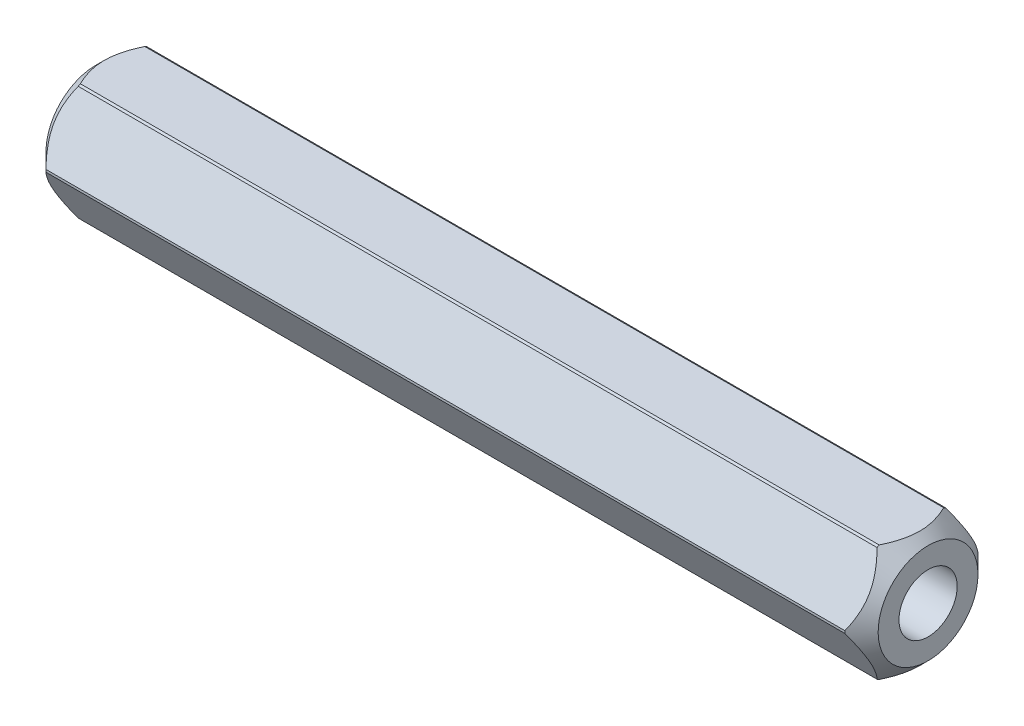
ISO-10303-21;
HEADER;
FILE_DESCRIPTION(('STEP AP214'),'2;1');
FILE_NAME('part.step','',(''),(''),'','','');
FILE_SCHEMA(('AUTOMOTIVE_DESIGN { 1 0 10303 214 1 1 1 1 }'));
ENDSEC;
DATA;
#1=APPLICATION_CONTEXT('core data for automotive mechanical design processes');
#2=APPLICATION_PROTOCOL_DEFINITION('international standard','automotive_design',2000,#1);
#3=PRODUCT_CONTEXT('',#1,'mechanical');
#4=PRODUCT('Part','Part','',(#3));
#5=PRODUCT_RELATED_PRODUCT_CATEGORY('part','',(#4));
#6=PRODUCT_DEFINITION_FORMATION('','',#4);
#7=PRODUCT_DEFINITION_CONTEXT('part definition',#1,'design');
#8=PRODUCT_DEFINITION('design','',#6,#7);
#9=PRODUCT_DEFINITION_SHAPE('','',#8);
#10=(LENGTH_UNIT() NAMED_UNIT(*) SI_UNIT(.MILLI.,.METRE.));
#11=(NAMED_UNIT(*) PLANE_ANGLE_UNIT() SI_UNIT($,.RADIAN.));
#12=(NAMED_UNIT(*) SI_UNIT($,.STERADIAN.) SOLID_ANGLE_UNIT());
#13=UNCERTAINTY_MEASURE_WITH_UNIT(LENGTH_MEASURE(1.E-05),#10,'distance_accuracy_value','');
#14=(GEOMETRIC_REPRESENTATION_CONTEXT(3) GLOBAL_UNCERTAINTY_ASSIGNED_CONTEXT((#13)) GLOBAL_UNIT_ASSIGNED_CONTEXT((#10,
#11,#12)) REPRESENTATION_CONTEXT('',''));
#15=CARTESIAN_POINT('',(0.,0.,0.));
#16=DIRECTION('',(0.,0.,1.));
#17=DIRECTION('',(1.,0.,0.));
#18=AXIS2_PLACEMENT_3D('',#15,#16,#17);
#19=CARTESIAN_POINT('',(25.,0.,0.));
#20=DIRECTION('',(1.,0.,0.));
#21=DIRECTION('',(0.,0.,-1.));
#22=AXIS2_PLACEMENT_3D('',#19,#20,#21);
#23=PLANE('',#22);
#24=CARTESIAN_POINT('',(25.,0.,0.));
#25=DIRECTION('',(1.,0.,0.));
#26=DIRECTION('',(0.,0.,-1.));
#27=AXIS2_PLACEMENT_3D('',#24,#25,#26);
#28=CIRCLE('',#27,1.75);
#29=CARTESIAN_POINT('',(25.,0.,-1.75));
#30=VERTEX_POINT('',#29);
#31=EDGE_CURVE('E190',#30,#30,#28,.T.);
#32=ORIENTED_EDGE('',*,*,#31,.F.);
#33=EDGE_LOOP('',(#32));
#34=FACE_BOUND('',#33,.T.);
#35=CARTESIAN_POINT('',(25.,0.,0.));
#36=DIRECTION('',(1.,0.,0.));
#37=DIRECTION('',(0.,0.,-1.));
#38=AXIS2_PLACEMENT_3D('',#35,#36,#37);
#39=CIRCLE('',#38,3.00000000000016);
#40=CARTESIAN_POINT('',(25.,0.,-3.00000000000016));
#41=VERTEX_POINT('',#40);
#42=EDGE_CURVE('E300',#41,#41,#39,.F.);
#43=ORIENTED_EDGE('',*,*,#42,.F.);
#44=EDGE_LOOP('',(#43));
#45=FACE_BOUND('',#44,.T.);
#46=ADVANCED_FACE('F34',(#34,#45),#23,.T.);
#47=CARTESIAN_POINT('',(-25.,0.,0.));
#48=DIRECTION('',(1.,0.,0.));
#49=DIRECTION('',(0.,0.,-1.));
#50=AXIS2_PLACEMENT_3D('',#47,#48,#49);
#51=PLANE('',#50);
#52=CARTESIAN_POINT('',(-25.,0.,0.));
#53=DIRECTION('',(1.,0.,0.));
#54=DIRECTION('',(0.,0.,-1.));
#55=AXIS2_PLACEMENT_3D('',#52,#53,#54);
#56=CIRCLE('',#55,3.);
#57=CARTESIAN_POINT('',(-25.,0.,-3.));
#58=VERTEX_POINT('',#57);
#59=EDGE_CURVE('E272',#58,#58,#56,.F.);
#60=ORIENTED_EDGE('',*,*,#59,.T.);
#61=EDGE_LOOP('',(#60));
#62=FACE_BOUND('',#61,.T.);
#63=CARTESIAN_POINT('',(-25.,0.,0.));
#64=DIRECTION('',(1.,0.,0.));
#65=DIRECTION('',(0.,0.,-1.));
#66=AXIS2_PLACEMENT_3D('',#63,#64,#65);
#67=CIRCLE('',#66,1.75);
#68=CARTESIAN_POINT('',(-25.,0.,-1.75));
#69=VERTEX_POINT('',#68);
#70=EDGE_CURVE('E187',#69,#69,#67,.T.);
#71=ORIENTED_EDGE('',*,*,#70,.T.);
#72=EDGE_LOOP('',(#71));
#73=FACE_BOUND('',#72,.T.);
#74=ADVANCED_FACE('F320',(#62,#73),#51,.F.);
#75=CARTESIAN_POINT('',(-25.,0.,0.));
#76=DIRECTION('',(1.,0.,0.));
#77=DIRECTION('',(0.,0.,-1.));
#78=AXIS2_PLACEMENT_3D('',#75,#76,#77);
#79=CYLINDRICAL_SURFACE('',#78,1.75);
#80=ORIENTED_EDGE('',*,*,#70,.F.);
#81=EDGE_LOOP('',(#80));
#82=FACE_BOUND('',#81,.T.);
#83=ORIENTED_EDGE('',*,*,#31,.T.);
#84=EDGE_LOOP('',(#83));
#85=FACE_BOUND('',#84,.T.);
#86=ADVANCED_FACE('F339',(#82,#85),#79,.F.);
#87=CARTESIAN_POINT('',(24.,0.,0.));
#88=DIRECTION('',(-1.,0.,0.));
#89=DIRECTION('',(0.,0.,1.));
#90=AXIS2_PLACEMENT_3D('',#87,#88,#89);
#91=CONICAL_SURFACE('',#90,4.00000000000016,0.785398163397443);
#92=ORIENTED_EDGE('',*,*,#42,.T.);
#93=EDGE_LOOP('',(#92));
#94=FACE_BOUND('',#93,.T.);
#95=CARTESIAN_POINT('',(24.,0.,0.));
#96=DIRECTION('',(1.,0.,0.));
#97=DIRECTION('',(0.,0.,-1.));
#98=AXIS2_PLACEMENT_3D('',#95,#96,#97);
#99=CIRCLE('',#98,4.00000000000016);
#100=CARTESIAN_POINT('',(24.,-0.0729490168751597,-3.99933474979755));
#101=VERTEX_POINT('',#100);
#102=CARTESIAN_POINT('',(24.,0.0729490168751608,-3.99933474979755));
#103=VERTEX_POINT('',#102);
#104=EDGE_CURVE('E121',#101,#103,#99,.T.);
#105=ORIENTED_EDGE('',*,*,#104,.T.);
#106=CARTESIAN_POINT('',(23.9998881914973,3.42725098312484,-2.06272760663984));
#107=CARTESIAN_POINT('',(24.0647344125968,3.31117807943082,-2.12974232883321));
#108=CARTESIAN_POINT('',(24.1255786856645,3.19320798493787,-2.19785239464504));
#109=CARTESIAN_POINT('',(24.2366317215761,2.95289734682205,-2.33659580625034));
#110=CARTESIAN_POINT('',(24.286784041153,2.83053740838046,-2.40724034964761));
#111=CARTESIAN_POINT('',(24.3724702813317,2.58385923610752,-2.5496600588126));
#112=CARTESIAN_POINT('',(24.4082044941501,2.4595946520742,-2.62140424985497));
#113=CARTESIAN_POINT('',(24.4630245319929,2.20853719475156,-2.76635234042227));
#114=CARTESIAN_POINT('',(24.4821471825276,2.0817505545735,-2.83955264125872));
#115=CARTESIAN_POINT('',(24.4994162555899,1.85969340087908,-2.96775739871967));
#116=CARTESIAN_POINT('',(24.5016761760366,1.76465432492154,-3.02262823480729));
#117=CARTESIAN_POINT('',(24.4958688245801,1.57477790433149,-3.13225343734772));
#118=CARTESIAN_POINT('',(24.4877980805935,1.47994063825887,-3.18700775844395));
#119=CARTESIAN_POINT('',(24.4617912511376,1.29121234851855,-3.29597008732923));
#120=CARTESIAN_POINT('',(24.4438458023953,1.19732230919821,-3.35017752680505));
#121=CARTESIAN_POINT('',(24.3990644171697,1.01118607536053,-3.45764333151718));
#122=CARTESIAN_POINT('',(24.3722292687288,0.918939735898197,-3.51090178043751));
#123=CARTESIAN_POINT('',(24.2978081761367,0.69754005659038,-3.63872694488438));
#124=CARTESIAN_POINT('',(24.2462514082614,0.569386591849765,-3.71271638224996));
#125=CARTESIAN_POINT('',(24.1599489411143,0.380574161794556,-3.82172728956868));
#126=CARTESIAN_POINT('',(24.1297390066747,0.318297366937098,-3.8576828138439));
#127=CARTESIAN_POINT('',(24.066693541996,0.194772982909786,-3.92899965021355));
#128=CARTESIAN_POINT('',(24.0338589491643,0.133525035657155,-3.96436116904717));
#129=CARTESIAN_POINT('',(23.9998881914973,0.0727490168751591,-3.99945021985123));
#130=B_SPLINE_CURVE_WITH_KNOTS('',3,(#106,#107,#108,#109,#110,#111,#112,#113,#114,#115,#116,
#117,#118,#119,#120,#121,#122,#123,#124,#125,#126,#127,#128,#129),.UNSPECIFIED.,.F.,.F.,(4,2,2,
2,2,2,2,2,2,2,2,4),(0.,0.446958060798127,0.896220203678139,1.33900659915566,1.78080887560877,
2.10963588118584,2.43857343285382,2.76782342451617,3.09704423706705,3.56636893069617,
3.80032900351678,4.03420588673434),.UNSPECIFIED.);
#131=CARTESIAN_POINT('',(24.0000000000002,3.42705098312484,-2.06284307669368));
#132=VERTEX_POINT('',#131);
#133=EDGE_CURVE('E57',#132,#103,#130,.T.);
#134=ORIENTED_EDGE('',*,*,#133,.F.);
#135=CARTESIAN_POINT('',(24.0000000000001,0.,0.));
#136=DIRECTION('',(-1.,0.,0.));
#137=DIRECTION('',(0.,0.,1.));
#138=AXIS2_PLACEMENT_3D('',#135,#136,#137);
#139=CIRCLE('',#138,4.);
#140=CARTESIAN_POINT('',(24.,3.50000000000015,-1.93649167310379));
#141=VERTEX_POINT('',#140);
#142=EDGE_CURVE('E43',#132,#141,#139,.F.);
#143=ORIENTED_EDGE('',*,*,#142,.T.);
#144=CARTESIAN_POINT('',(22.770955868488,3.5,-3.88495849775799));
#145=CARTESIAN_POINT('',(22.8417265484129,3.5,-3.78968133342106));
#146=CARTESIAN_POINT('',(22.9117700859078,3.5,-3.69385487477247));
#147=CARTESIAN_POINT('',(23.0500827470865,3.5,-3.50089311100164));
#148=CARTESIAN_POINT('',(23.1183513990306,3.5,-3.40375746812528));
#149=CARTESIAN_POINT('',(23.2532777387967,3.5,-3.20725800739164));
#150=CARTESIAN_POINT('',(23.3199188270478,3.5,-3.10788275154336));
#151=CARTESIAN_POINT('',(23.4505691257805,3.5,-2.90742211436168));
#152=CARTESIAN_POINT('',(23.5145785267291,3.5,-2.80633685753881));
#153=CARTESIAN_POINT('',(23.6426606488874,3.5,-2.596850831127));
#154=CARTESIAN_POINT('',(23.7065611101522,3.5,-2.48834419748431));
#155=CARTESIAN_POINT('',(23.82995417224,3.5,-2.26881604431269));
#156=CARTESIAN_POINT('',(23.8894461095312,3.5,-2.15779414947928));
#157=CARTESIAN_POINT('',(24.0027259557816,3.5,-1.93327831444902));
#158=CARTESIAN_POINT('',(24.0565306242003,3.5,-1.81979289704174));
#159=CARTESIAN_POINT('',(24.1572328785999,3.5,-1.58982274063083));
#160=CARTESIAN_POINT('',(24.2041334825553,3.5,-1.47333933845417));
#161=CARTESIAN_POINT('',(24.2866255868552,3.5,-1.24488640020419));
#162=CARTESIAN_POINT('',(24.322752349878,3.5,-1.13311221313753));
#163=CARTESIAN_POINT('',(24.3860160984176,3.5,-0.906999927508603));
#164=CARTESIAN_POINT('',(24.4131524219555,3.5,-0.792661640809517));
#165=CARTESIAN_POINT('',(24.4566050704742,3.5,-0.563937922529062));
#166=CARTESIAN_POINT('',(24.4730982320407,3.5,-0.449586630662198));
#167=CARTESIAN_POINT('',(24.4949670259914,3.5,-0.219820733556376));
#168=CARTESIAN_POINT('',(24.5003442947514,3.5,-0.104406287337859));
#169=CARTESIAN_POINT('',(24.4996324107893,3.5,0.122807086362507));
#170=CARTESIAN_POINT('',(24.4938932489386,3.5,0.234607277156806));
#171=CARTESIAN_POINT('',(24.4720065025217,3.5,0.45717759421166));
#172=CARTESIAN_POINT('',(24.455857864505,3.5,0.567947615066796));
#173=CARTESIAN_POINT('',(24.4137330629689,3.5,0.789526981963729));
#174=CARTESIAN_POINT('',(24.3875944739596,3.5,0.900304974150864));
#175=CARTESIAN_POINT('',(24.3268401154054,3.5,1.11946317061419));
#176=CARTESIAN_POINT('',(24.2922252234766,3.5,1.22784362186017));
#177=CARTESIAN_POINT('',(24.2110957214909,3.5,1.45550446251114));
#178=CARTESIAN_POINT('',(24.1636324842807,3.5,1.5744437105933));
#179=CARTESIAN_POINT('',(24.0614691466234,3.5,1.80919998491844));
#180=CARTESIAN_POINT('',(24.0067655718904,3.5,1.92501547990321));
#181=CARTESIAN_POINT('',(23.8914282911651,3.5,2.15410976764514));
#182=CARTESIAN_POINT('',(23.8307756465663,3.5,2.26737894885669));
#183=CARTESIAN_POINT('',(23.7048864441281,3.5,2.49129904445797));
#184=CARTESIAN_POINT('',(23.6396506383729,3.5,2.60195038446311));
#185=CARTESIAN_POINT('',(23.5088754315315,3.5,2.81548535770476));
#186=CARTESIAN_POINT('',(23.4435161158836,3.5,2.91847986517955));
#187=CARTESIAN_POINT('',(23.3100853837606,3.5,3.12270257109716));
#188=CARTESIAN_POINT('',(23.2420137600851,3.5,3.22393063374388));
#189=CARTESIAN_POINT('',(23.1042146179666,3.5,3.4240244444429));
#190=CARTESIAN_POINT('',(23.0345052925373,3.5,3.52290276638669));
#191=CARTESIAN_POINT('',(22.8932703201578,3.5,3.71931403126321));
#192=CARTESIAN_POINT('',(22.8217451761454,3.5,3.81684733542887));
#193=CARTESIAN_POINT('',(22.7494785915831,3.5,3.91381847563807));
#194=B_SPLINE_CURVE_WITH_KNOTS('',3,(#144,#145,#146,#147,#148,#149,#150,#151,#152,#153,#154,
#155,#156,#157,#158,#159,#160,#161,#162,#163,#164,#165,#166,#167,#168,#169,#170,#171,#172,#173,
#174,#175,#176,#177,#178,#179,#180,#181,#182,#183,#184,#185,#186,#187,#188,#189,#190,#191,#192,
#193),.UNSPECIFIED.,.F.,.F.,(4,2,2,2,2,2,2,2,2,2,2,2,2,2,2,2,2,2,2,2,2,2,2,2,4),(0.,
0.356063700307526,0.712221089425062,1.07114059459626,1.43003407724958,1.80772404165316,
2.18547073760476,2.56207127442214,2.93850669581974,3.29059437139971,3.6427079659425,
3.98880933268275,4.33485974605545,4.67019194132503,5.00555807791287,5.34662632483161,
5.6876592732819,6.0715350021399,6.45559560668382,6.84092119044734,7.22618369036803,
7.59208083740621,7.95800599009131,8.32092560301541,8.68374576965352),.UNSPECIFIED.);
#195=CARTESIAN_POINT('',(24.,3.50000000000015,1.93649167310379));
#196=VERTEX_POINT('',#195);
#197=EDGE_CURVE('E140',#196,#141,#194,.F.);
#198=ORIENTED_EDGE('',*,*,#197,.F.);
#199=CARTESIAN_POINT('',(24.,3.42705098312499,2.06284307669377));
#200=VERTEX_POINT('',#199);
#201=EDGE_CURVE('E131',#196,#200,#99,.T.);
#202=ORIENTED_EDGE('',*,*,#201,.T.);
#203=CARTESIAN_POINT('',(23.9998881914973,0.0727490168751583,3.99945021985123));
#204=CARTESIAN_POINT('',(24.0647344125968,0.18882192056918,3.93243549765786));
#205=CARTESIAN_POINT('',(24.1255786856645,0.306792015062135,3.86432543184603));
#206=CARTESIAN_POINT('',(24.2366317215761,0.547102653177949,3.72558202024073));
#207=CARTESIAN_POINT('',(24.286784041153,0.669462591619539,3.65493747684345));
#208=CARTESIAN_POINT('',(24.3724702813317,0.916140763892482,3.51251776767847));
#209=CARTESIAN_POINT('',(24.4082044941501,1.0404053479258,3.44077357663609));
#210=CARTESIAN_POINT('',(24.4630245319929,1.29146280524844,3.2958254860688));
#211=CARTESIAN_POINT('',(24.4821471825276,1.41824944542651,3.22262518523235));
#212=CARTESIAN_POINT('',(24.4994162555899,1.64030659912093,3.09442042777139));
#213=CARTESIAN_POINT('',(24.5016761760366,1.73534567507847,3.03954959168378));
#214=CARTESIAN_POINT('',(24.4958688245801,1.92522209566852,2.92992438914335));
#215=CARTESIAN_POINT('',(24.4877980805935,2.02005936174113,2.87517006804711));
#216=CARTESIAN_POINT('',(24.4617912511376,2.20878765148146,2.76620773916184));
#217=CARTESIAN_POINT('',(24.4438458023953,2.3026776908018,2.71200029968602));
#218=CARTESIAN_POINT('',(24.3990644171697,2.48881392463948,2.60453449497389));
#219=CARTESIAN_POINT('',(24.3722292687288,2.58106026410181,2.55127604605356));
#220=CARTESIAN_POINT('',(24.2978081761367,2.80245994340962,2.42345088160669));
#221=CARTESIAN_POINT('',(24.2462514082614,2.93061340815024,2.34946144424111));
#222=CARTESIAN_POINT('',(24.1599489411143,3.11942583820545,2.24045053692239));
#223=CARTESIAN_POINT('',(24.1297390066747,3.1817026330629,2.20449501264717));
#224=CARTESIAN_POINT('',(24.0666935419961,3.30522701709021,2.13317817627752));
#225=CARTESIAN_POINT('',(24.0338589491643,3.36647496434285,2.0978166574439));
#226=CARTESIAN_POINT('',(23.9998881914973,3.42725098312484,2.06272760663984));
#227=B_SPLINE_CURVE_WITH_KNOTS('',3,(#203,#204,#205,#206,#207,#208,#209,#210,#211,#212,#213,
#214,#215,#216,#217,#218,#219,#220,#221,#222,#223,#224,#225,#226),.UNSPECIFIED.,.F.,.F.,(4,2,2,
2,2,2,2,2,2,2,2,4),(0.,0.446958060798129,0.896220203678141,1.33900659915567,1.78080887560878,
2.10963588118585,2.43857343285383,2.76782342451618,3.09704423706706,3.56636893069617,
3.80032900351678,4.03420588673434),.UNSPECIFIED.);
#228=CARTESIAN_POINT('',(24.,0.0729490168751613,3.99933474979755));
#229=VERTEX_POINT('',#228);
#230=EDGE_CURVE('E164',#229,#200,#227,.T.);
#231=ORIENTED_EDGE('',*,*,#230,.F.);
#232=CARTESIAN_POINT('',(24.,-0.0729490168751628,3.99933474979755));
#233=VERTEX_POINT('',#232);
#234=EDGE_CURVE('E295',#229,#233,#99,.T.);
#235=ORIENTED_EDGE('',*,*,#234,.T.);
#236=CARTESIAN_POINT('',(23.9998881914972,-3.42725098312484,2.06272760663984));
#237=CARTESIAN_POINT('',(24.0647344125968,-3.31117807943082,2.12974232883321));
#238=CARTESIAN_POINT('',(24.1255786856645,-3.19320798493787,2.19785239464504));
#239=CARTESIAN_POINT('',(24.2366317215761,-2.95289734682205,2.33659580625034));
#240=CARTESIAN_POINT('',(24.286784041153,-2.83053740838046,2.40724034964762));
#241=CARTESIAN_POINT('',(24.3724702813317,-2.58385923610752,2.54966005881261));
#242=CARTESIAN_POINT('',(24.4082044941501,-2.4595946520742,2.62140424985498));
#243=CARTESIAN_POINT('',(24.4630245319929,-2.20853719475155,2.76635234042227));
#244=CARTESIAN_POINT('',(24.4821471825276,-2.08175055457349,2.83955264125873));
#245=CARTESIAN_POINT('',(24.4994162555899,-1.85969340087907,2.96775739871968));
#246=CARTESIAN_POINT('',(24.5016761760366,-1.76465432492153,3.0226282348073));
#247=CARTESIAN_POINT('',(24.4958688245801,-1.57477790433148,3.13225343734773));
#248=CARTESIAN_POINT('',(24.4877980805935,-1.47994063825886,3.18700775844396));
#249=CARTESIAN_POINT('',(24.4617912511376,-1.29121234851854,3.29597008732924));
#250=CARTESIAN_POINT('',(24.4438458023953,-1.1973223091982,3.35017752680506));
#251=CARTESIAN_POINT('',(24.3990644171697,-1.01118607536052,3.45764333151719));
#252=CARTESIAN_POINT('',(24.3722292687288,-0.918939735898186,3.51090178043752));
#253=CARTESIAN_POINT('',(24.2978081761367,-0.697540056590371,3.63872694488438));
#254=CARTESIAN_POINT('',(24.2462514082614,-0.569386591849757,3.71271638224996));
#255=CARTESIAN_POINT('',(24.1599489411143,-0.380574161794552,3.82172728956868));
#256=CARTESIAN_POINT('',(24.1297390066747,-0.318297366937095,3.8576828138439));
#257=CARTESIAN_POINT('',(24.066693541996,-0.194772982909786,3.92899965021355));
#258=CARTESIAN_POINT('',(24.0338589491643,-0.133525035657156,3.96436116904717));
#259=CARTESIAN_POINT('',(23.9998881914973,-0.0727490168751602,3.99945021985123));
#260=B_SPLINE_CURVE_WITH_KNOTS('',3,(#236,#237,#238,#239,#240,#241,#242,#243,#244,#245,#246,
#247,#248,#249,#250,#251,#252,#253,#254,#255,#256,#257,#258,#259),.UNSPECIFIED.,.F.,.F.,(4,2,2,
2,2,2,2,2,2,2,2,4),(0.,0.446958060798129,0.896220203678143,1.33900659915567,1.78080887560878,
2.10963588118585,2.43857343285383,2.76782342451619,3.09704423706706,3.56636893069617,
3.80032900351678,4.03420588673433),.UNSPECIFIED.);
#261=CARTESIAN_POINT('',(24.,-3.42705098312498,2.06284307669377));
#262=VERTEX_POINT('',#261);
#263=EDGE_CURVE('E310',#262,#233,#260,.T.);
#264=ORIENTED_EDGE('',*,*,#263,.F.);
#265=CARTESIAN_POINT('',(24.,-3.50000000000014,1.93649167310378));
#266=VERTEX_POINT('',#265);
#267=EDGE_CURVE('E297',#262,#266,#99,.T.);
#268=ORIENTED_EDGE('',*,*,#267,.T.);
#269=CARTESIAN_POINT('',(22.7709558680862,-3.5,-3.88495849829873));
#270=CARTESIAN_POINT('',(22.8417265480265,-3.5,-3.78968133394703));
#271=CARTESIAN_POINT('',(22.9117700855368,-3.5,-3.69385487528361));
#272=CARTESIAN_POINT('',(23.0500827467462,-3.5,-3.50089311148296));
#273=CARTESIAN_POINT('',(23.1183513987055,-3.5,-3.40375746859162));
#274=CARTESIAN_POINT('',(23.2532777385023,-3.5,-3.20725800782749));
#275=CARTESIAN_POINT('',(23.3199188267688,-3.5,-3.10788275196371));
#276=CARTESIAN_POINT('',(23.450569125532,-3.5,-2.90742211475073));
#277=CARTESIAN_POINT('',(23.5145785264957,-3.5,-2.80633685791207));
#278=CARTESIAN_POINT('',(23.6426606486854,-3.5,-2.59685083146622));
#279=CARTESIAN_POINT('',(23.7065611099664,-3.5,-2.48834419780525));
#280=CARTESIAN_POINT('',(23.8299541720859,-3.5,-2.26881604459639));
#281=CARTESIAN_POINT('',(23.8894461093926,-3.5,-2.15779414974403));
#282=CARTESIAN_POINT('',(24.0027259556725,-3.5,-1.93327831467518));
#283=CARTESIAN_POINT('',(24.0565306241054,-3.5,-1.81979289724825));
#284=CARTESIAN_POINT('',(24.1572328785316,-3.5,-1.58982274079703));
#285=CARTESIAN_POINT('',(24.2041334824994,-3.5,-1.4733393385997));
#286=CARTESIAN_POINT('',(24.2866255868091,-3.5,-1.24488640034052));
#287=CARTESIAN_POINT('',(24.3227523498317,-3.5,-1.1331122132862));
#288=CARTESIAN_POINT('',(24.3860160983736,-3.5,-0.906999927682289));
#289=CARTESIAN_POINT('',(24.4131524219139,-3.5,-0.792661640995874));
#290=CARTESIAN_POINT('',(24.4566050704402,-3.5,-0.563937922740313));
#291=CARTESIAN_POINT('',(24.4730982320117,-3.5,-0.449586630885667));
#292=CARTESIAN_POINT('',(24.4949670259755,-3.5,-0.219820733803799));
#293=CARTESIAN_POINT('',(24.5003442947433,-3.5,-0.104406287597017));
#294=CARTESIAN_POINT('',(24.4996324107988,-3.5,0.12280708608014));
#295=CARTESIAN_POINT('',(24.493893248958,-3.5,0.234607276862938));
#296=CARTESIAN_POINT('',(24.4720065025623,-3.5,0.457177593895851));
#297=CARTESIAN_POINT('',(24.455857864557,-3.5,0.567947614740547));
#298=CARTESIAN_POINT('',(24.413733063045,-3.5,0.789526981616871));
#299=CARTESIAN_POINT('',(24.3875944740484,-3.5,0.900304973793862));
#300=CARTESIAN_POINT('',(24.3268401155199,-3.5,1.11946317023781));
#301=CARTESIAN_POINT('',(24.2922252236041,-3.5,1.22784362147455));
#302=CARTESIAN_POINT('',(24.2110957216563,-3.5,1.45550446207815));
#303=CARTESIAN_POINT('',(24.1636324844729,-3.5,1.57444371012301));
#304=CARTESIAN_POINT('',(24.0614691468721,-3.5,1.80919998437546));
#305=CARTESIAN_POINT('',(24.0067655721686,-3.5,1.92501547932484));
#306=CARTESIAN_POINT('',(23.8914282915042,-3.5,2.15410976699726));
#307=CARTESIAN_POINT('',(23.8307756469368,-3.5,2.26737894817471));
#308=CARTESIAN_POINT('',(23.7048864445622,-3.5,2.49129904370887));
#309=CARTESIAN_POINT('',(23.6396506388393,-3.5,2.601950383681));
#310=CARTESIAN_POINT('',(23.5088754320592,-3.5,2.81548535686258));
#311=CARTESIAN_POINT('',(23.4435161164402,-3.5,2.91847986431022));
#312=CARTESIAN_POINT('',(23.3100853843751,-3.5,3.12270257017389));
#313=CARTESIAN_POINT('',(23.2420137607286,-3.5,3.22393063279384));
#314=CARTESIAN_POINT('',(23.1042146186679,-3.5,3.42402444343994));
#315=CARTESIAN_POINT('',(23.0345052932673,-3.5,3.52290276535759));
#316=CARTESIAN_POINT('',(22.8932703209452,-3.5,3.719314030182));
#317=CARTESIAN_POINT('',(22.8217451769615,-3.5,3.81684733432168));
#318=CARTESIAN_POINT('',(22.7494785924277,-3.5,3.91381847450495));
#319=B_SPLINE_CURVE_WITH_KNOTS('',3,(#269,#270,#271,#272,#273,#274,#275,#276,#277,#278,#279,
#280,#281,#282,#283,#284,#285,#286,#287,#288,#289,#290,#291,#292,#293,#294,#295,#296,#297,#298,
#299,#300,#301,#302,#303,#304,#305,#306,#307,#308,#309,#310,#311,#312,#313,#314,#315,#316,#317,
#318),.UNSPECIFIED.,.F.,.F.,(4,2,2,2,2,2,2,2,2,2,2,2,2,2,2,2,2,2,2,2,2,2,2,2,4),(0.,
0.35606370037065,0.712221089551328,1.07114059478685,1.43003407750449,1.80772404198,
2.18547073800357,2.56207127489234,2.93850669636121,3.29059437190597,3.6427079664136,
3.98880933311997,4.33485974645878,4.67019194169253,5.00555807824451,5.34662632512493,
5.6876592735369,6.07153500226128,6.45559560667139,6.84092119030036,7.22618369008655,
7.59208083700947,7.9580059895793,8.32092560238972,8.68374576891414),.UNSPECIFIED.);
#320=CARTESIAN_POINT('',(24.,-3.50000000000014,-1.93649167310378));
#321=VERTEX_POINT('',#320);
#322=EDGE_CURVE('E303',#321,#266,#319,.T.);
#323=ORIENTED_EDGE('',*,*,#322,.F.);
#324=CARTESIAN_POINT('',(24.,-3.42705098312498,-2.06284307669377));
#325=VERTEX_POINT('',#324);
#326=EDGE_CURVE('E129',#321,#325,#99,.T.);
#327=ORIENTED_EDGE('',*,*,#326,.T.);
#328=CARTESIAN_POINT('',(23.9998881914973,-0.0727490168751568,-3.99945021985123));
#329=CARTESIAN_POINT('',(24.0647344125968,-0.188821920569178,-3.93243549765786));
#330=CARTESIAN_POINT('',(24.1255786856645,-0.306792015062133,-3.86432543184603));
#331=CARTESIAN_POINT('',(24.2366317215761,-0.547102653177947,-3.72558202024073));
#332=CARTESIAN_POINT('',(24.286784041153,-0.669462591619537,-3.65493747684346));
#333=CARTESIAN_POINT('',(24.3724702813317,-0.91614076389248,-3.51251776767847));
#334=CARTESIAN_POINT('',(24.4082044941501,-1.0404053479258,-3.4407735766361));
#335=CARTESIAN_POINT('',(24.4630245319929,-1.29146280524844,-3.2958254860688));
#336=CARTESIAN_POINT('',(24.4821471825276,-1.4182494454265,-3.22262518523235));
#337=CARTESIAN_POINT('',(24.4994162555899,-1.64030659912092,-3.0944204277714));
#338=CARTESIAN_POINT('',(24.5016761760366,-1.73534567507846,-3.03954959168378));
#339=CARTESIAN_POINT('',(24.4958688245801,-1.92522209566851,-2.92992438914335));
#340=CARTESIAN_POINT('',(24.4877980805935,-2.02005936174113,-2.87517006804712));
#341=CARTESIAN_POINT('',(24.4617912511376,-2.20878765148145,-2.76620773916184));
#342=CARTESIAN_POINT('',(24.4438458023953,-2.30267769080179,-2.71200029968602));
#343=CARTESIAN_POINT('',(24.3990644171697,-2.48881392463947,-2.60453449497389));
#344=CARTESIAN_POINT('',(24.3722292687288,-2.5810602641018,-2.55127604605356));
#345=CARTESIAN_POINT('',(24.2978081761367,-2.80245994340962,-2.42345088160669));
#346=CARTESIAN_POINT('',(24.2462514082614,-2.93061340815024,-2.34946144424112));
#347=CARTESIAN_POINT('',(24.1599489411143,-3.11942583820544,-2.24045053692239));
#348=CARTESIAN_POINT('',(24.1297390066747,-3.1817026330629,-2.20449501264717));
#349=CARTESIAN_POINT('',(24.066693541996,-3.30522701709021,-2.13317817627752));
#350=CARTESIAN_POINT('',(24.0338589491643,-3.36647496434284,-2.0978166574439));
#351=CARTESIAN_POINT('',(23.9998881914972,-3.42725098312484,-2.06272760663984));
#352=B_SPLINE_CURVE_WITH_KNOTS('',3,(#328,#329,#330,#331,#332,#333,#334,#335,#336,#337,#338,
#339,#340,#341,#342,#343,#344,#345,#346,#347,#348,#349,#350,#351),.UNSPECIFIED.,.F.,.F.,(4,2,2,
2,2,2,2,2,2,2,2,4),(0.,0.446958060798127,0.896220203678139,1.33900659915566,1.78080887560877,
2.10963588118584,2.43857343285382,2.76782342451617,3.09704423706705,3.56636893069616,
3.80032900351678,4.03420588673434),.UNSPECIFIED.);
#353=EDGE_CURVE('E124',#101,#325,#352,.T.);
#354=ORIENTED_EDGE('',*,*,#353,.F.);
#355=EDGE_LOOP('',(#105,#134,#143,#198,#202,#231,#235,#264,#268,#323,#327,#354));
#356=FACE_BOUND('',#355,.T.);
#357=ADVANCED_FACE('F122',(#94,#356),#91,.T.);
#358=CARTESIAN_POINT('',(-25.5,0.,0.));
#359=DIRECTION('',(1.,0.,0.));
#360=DIRECTION('',(0.,0.,-1.));
#361=AXIS2_PLACEMENT_3D('',#358,#359,#360);
#362=CONICAL_SURFACE('',#361,2.5,0.785398163397448);
#363=ORIENTED_EDGE('',*,*,#59,.F.);
#364=EDGE_LOOP('',(#363));
#365=FACE_BOUND('',#364,.T.);
#366=CARTESIAN_POINT('',(-24.,0.,0.));
#367=DIRECTION('',(1.,0.,0.));
#368=DIRECTION('',(0.,0.,-1.));
#369=AXIS2_PLACEMENT_3D('',#366,#367,#368);
#370=CIRCLE('',#369,4.);
#371=CARTESIAN_POINT('',(-24.,-3.49999999999999,-1.9364916731037));
#372=VERTEX_POINT('',#371);
#373=CARTESIAN_POINT('',(-24.,-3.42705098312483,-2.06284307669368));
#374=VERTEX_POINT('',#373);
#375=EDGE_CURVE('E439',#372,#374,#370,.T.);
#376=ORIENTED_EDGE('',*,*,#375,.F.);
#377=CARTESIAN_POINT('',(-22.7709558680861,-3.5,-3.88495849829863));
#378=CARTESIAN_POINT('',(-22.8417265480264,-3.5,-3.78968133394692));
#379=CARTESIAN_POINT('',(-22.9117700855367,-3.5,-3.69385487528351));
#380=CARTESIAN_POINT('',(-23.0500827467461,-3.5,-3.50089311148286));
#381=CARTESIAN_POINT('',(-23.1183513987054,-3.5,-3.40375746859152));
#382=CARTESIAN_POINT('',(-23.2532777385022,-3.5,-3.2072580078274));
#383=CARTESIAN_POINT('',(-23.3199188267687,-3.5,-3.10788275196362));
#384=CARTESIAN_POINT('',(-23.4505691255319,-3.5,-2.90742211475064));
#385=CARTESIAN_POINT('',(-23.5145785264957,-3.5,-2.80633685791198));
#386=CARTESIAN_POINT('',(-23.6426606486853,-3.5,-2.59685083146614));
#387=CARTESIAN_POINT('',(-23.7065611099663,-3.5,-2.48834419780517));
#388=CARTESIAN_POINT('',(-23.8299541720858,-3.5,-2.26881604459631));
#389=CARTESIAN_POINT('',(-23.8894461093925,-3.5,-2.15779414974395));
#390=CARTESIAN_POINT('',(-24.0027259556724,-3.5,-1.93327831467511));
#391=CARTESIAN_POINT('',(-24.0565306241052,-3.5,-1.81979289724819));
#392=CARTESIAN_POINT('',(-24.1572328785315,-3.5,-1.58982274079697));
#393=CARTESIAN_POINT('',(-24.2041334824992,-3.5,-1.47333933859964));
#394=CARTESIAN_POINT('',(-24.286625586809,-3.5,-1.24488640034047));
#395=CARTESIAN_POINT('',(-24.3227523498316,-3.5,-1.13311221328614));
#396=CARTESIAN_POINT('',(-24.3860160983735,-3.5,-0.906999927682235));
#397=CARTESIAN_POINT('',(-24.4131524219138,-3.5,-0.792661640995821));
#398=CARTESIAN_POINT('',(-24.45660507044,-3.5,-0.563937922740261));
#399=CARTESIAN_POINT('',(-24.4730982320116,-3.5,-0.449586630885616));
#400=CARTESIAN_POINT('',(-24.4949670259754,-3.5,-0.21982073380375));
#401=CARTESIAN_POINT('',(-24.5003442947431,-3.5,-0.104406287596969));
#402=CARTESIAN_POINT('',(-24.4996324107986,-3.5,0.122807086080186));
#403=CARTESIAN_POINT('',(-24.4938932489578,-3.5,0.234607276862984));
#404=CARTESIAN_POINT('',(-24.4720065025622,-3.5,0.457177593895896));
#405=CARTESIAN_POINT('',(-24.4558578645568,-3.5,0.567947614740591));
#406=CARTESIAN_POINT('',(-24.4137330630448,-3.5,0.789526981616912));
#407=CARTESIAN_POINT('',(-24.3875944740482,-3.5,0.900304973793903));
#408=CARTESIAN_POINT('',(-24.3268401155198,-3.5,1.11946317023785));
#409=CARTESIAN_POINT('',(-24.292225223604,-3.5,1.22784362147459));
#410=CARTESIAN_POINT('',(-24.2110957216561,-3.5,1.45550446207819));
#411=CARTESIAN_POINT('',(-24.1636324844728,-3.5,1.57444371012306));
#412=CARTESIAN_POINT('',(-24.0614691468719,-3.5,1.80919998437552));
#413=CARTESIAN_POINT('',(-24.0067655721685,-3.5,1.9250154793249));
#414=CARTESIAN_POINT('',(-23.891428291504,-3.5,2.15410976699733));
#415=CARTESIAN_POINT('',(-23.8307756469366,-3.5,2.26737894817478));
#416=CARTESIAN_POINT('',(-23.704886444562,-3.5,2.49129904370894));
#417=CARTESIAN_POINT('',(-23.6396506388391,-3.5,2.60195038368108));
#418=CARTESIAN_POINT('',(-23.508875432059,-3.5,2.81548535686267));
#419=CARTESIAN_POINT('',(-23.44351611644,-3.5,2.91847986431032));
#420=CARTESIAN_POINT('',(-23.3100853843749,-3.5,3.122702570174));
#421=CARTESIAN_POINT('',(-23.2420137607284,-3.5,3.22393063279394));
#422=CARTESIAN_POINT('',(-23.1042146186677,-3.5,3.42402444344006));
#423=CARTESIAN_POINT('',(-23.0345052932671,-3.5,3.52290276535771));
#424=CARTESIAN_POINT('',(-22.8932703209449,-3.5,3.71931403018213));
#425=CARTESIAN_POINT('',(-22.8217451769612,-3.5,3.81684733432182));
#426=CARTESIAN_POINT('',(-22.7494785924275,-3.5,3.91381847450509));
#427=B_SPLINE_CURVE_WITH_KNOTS('',3,(#377,#378,#379,#380,#381,#382,#383,#384,#385,#386,#387,
#388,#389,#390,#391,#392,#393,#394,#395,#396,#397,#398,#399,#400,#401,#402,#403,#404,#405,#406,
#407,#408,#409,#410,#411,#412,#413,#414,#415,#416,#417,#418,#419,#420,#421,#422,#423,#424,#425,
#426),.UNSPECIFIED.,.F.,.F.,(4,2,2,2,2,2,2,2,2,2,2,2,2,2,2,2,2,2,2,2,2,2,2,2,4),(0.,
0.35606370037064,0.71222108955131,1.07114059478682,1.43003407750445,1.80772404197995,
2.18547073800351,2.56207127489227,2.93850669636113,3.29059437190588,3.64270796641351,
3.98880933311988,4.33485974645869,4.67019194169244,5.00555807824441,5.34662632512483,
5.6876592735368,6.07153500226119,6.45559560667132,6.8409211903003,7.22618369008651,
7.59208083700944,7.9580059895793,8.32092560238972,8.68374576891416),.UNSPECIFIED.);
#428=CARTESIAN_POINT('',(-24.,-3.49999999999999,1.9364916731037));
#429=VERTEX_POINT('',#428);
#430=EDGE_CURVE('E218',#429,#372,#427,.F.);
#431=ORIENTED_EDGE('',*,*,#430,.F.);
#432=CARTESIAN_POINT('',(-24.,-3.42705098312483,2.06284307669368));
#433=VERTEX_POINT('',#432);
#434=EDGE_CURVE('E440',#433,#429,#370,.T.);
#435=ORIENTED_EDGE('',*,*,#434,.F.);
#436=CARTESIAN_POINT('',(-23.9998881914971,-0.0727490168751598,3.99945021985123));
#437=CARTESIAN_POINT('',(-24.0647344125967,-0.188821920569182,3.93243549765786));
#438=CARTESIAN_POINT('',(-24.1255786856644,-0.306792015062138,3.86432543184603));
#439=CARTESIAN_POINT('',(-24.236631721576,-0.547102653177954,3.72558202024073));
#440=CARTESIAN_POINT('',(-24.2867840411528,-0.669462591619545,3.65493747684345));
#441=CARTESIAN_POINT('',(-24.3724702813315,-0.91614076389249,3.51251776767846));
#442=CARTESIAN_POINT('',(-24.40820449415,-1.04040534792581,3.44077357663609));
#443=CARTESIAN_POINT('',(-24.4630245319927,-1.29146280524845,3.2958254860688));
#444=CARTESIAN_POINT('',(-24.4821471825275,-1.41824944542652,3.22262518523234));
#445=CARTESIAN_POINT('',(-24.4994162555897,-1.64030659912094,3.09442042777139));
#446=CARTESIAN_POINT('',(-24.5016761760365,-1.73534567507848,3.03954959168377));
#447=CARTESIAN_POINT('',(-24.4958688245799,-1.92522209566854,2.92992438914334));
#448=CARTESIAN_POINT('',(-24.4877980805933,-2.02005936174115,2.8751700680471));
#449=CARTESIAN_POINT('',(-24.4617912511374,-2.20878765148148,2.76620773916183));
#450=CARTESIAN_POINT('',(-24.4438458023951,-2.30267769080182,2.712000299686));
#451=CARTESIAN_POINT('',(-24.3990644171695,-2.4888139246395,2.60453449497388));
#452=CARTESIAN_POINT('',(-24.3722292687286,-2.58106026410183,2.55127604605354));
#453=CARTESIAN_POINT('',(-24.2978081761365,-2.80245994340965,2.42345088160668));
#454=CARTESIAN_POINT('',(-24.2462514082613,-2.93061340815026,2.3494614442411));
#455=CARTESIAN_POINT('',(-24.1599489411141,-3.11942583820546,2.24045053692239));
#456=CARTESIAN_POINT('',(-24.1297390066745,-3.18170263306291,2.20449501264717));
#457=CARTESIAN_POINT('',(-24.0666935419959,-3.30522701709022,2.13317817627752));
#458=CARTESIAN_POINT('',(-24.0338589491642,-3.36647496434285,2.0978166574439));
#459=CARTESIAN_POINT('',(-23.9998881914971,-3.42725098312484,2.06272760663985));
#460=B_SPLINE_CURVE_WITH_KNOTS('',3,(#436,#437,#438,#439,#440,#441,#442,#443,#444,#445,#446,
#447,#448,#449,#450,#451,#452,#453,#454,#455,#456,#457,#458,#459),.UNSPECIFIED.,.F.,.F.,(4,2,2,
2,2,2,2,2,2,2,2,4),(0.,0.446958060798133,0.896220203678145,1.33900659915567,1.78080887560878,
2.10963588118586,2.43857343285385,2.7678234245162,3.09704423706709,3.56636893069618,
3.80032900351679,4.03420588673433),.UNSPECIFIED.);
#461=CARTESIAN_POINT('',(-24.,-0.0729490168751597,3.99933474979738));
#462=VERTEX_POINT('',#461);
#463=EDGE_CURVE('E228',#462,#433,#460,.T.);
#464=ORIENTED_EDGE('',*,*,#463,.F.);
#465=CARTESIAN_POINT('',(-24.,0.0729490168751582,3.99933474979738));
#466=VERTEX_POINT('',#465);
#467=EDGE_CURVE('E294',#466,#462,#370,.T.);
#468=ORIENTED_EDGE('',*,*,#467,.F.);
#469=CARTESIAN_POINT('',(-23.9998881914971,3.42725098312484,2.06272760663984));
#470=CARTESIAN_POINT('',(-24.0647344125967,3.31117807943082,2.12974232883321));
#471=CARTESIAN_POINT('',(-24.1255786856644,3.19320798493786,2.19785239464504));
#472=CARTESIAN_POINT('',(-24.236631721576,2.95289734682205,2.33659580625034));
#473=CARTESIAN_POINT('',(-24.2867840411528,2.83053740838046,2.40724034964762));
#474=CARTESIAN_POINT('',(-24.3724702813315,2.58385923610751,2.54966005881261));
#475=CARTESIAN_POINT('',(-24.40820449415,2.4595946520742,2.62140424985498));
#476=CARTESIAN_POINT('',(-24.4630245319927,2.20853719475155,2.76635234042227));
#477=CARTESIAN_POINT('',(-24.4821471825275,2.08175055457348,2.83955264125873));
#478=CARTESIAN_POINT('',(-24.4994162555897,1.85969340087906,2.96775739871968));
#479=CARTESIAN_POINT('',(-24.5016761760365,1.76465432492152,3.0226282348073));
#480=CARTESIAN_POINT('',(-24.4958688245799,1.57477790433147,3.13225343734773));
#481=CARTESIAN_POINT('',(-24.4877980805933,1.47994063825885,3.18700775844397));
#482=CARTESIAN_POINT('',(-24.4617912511374,1.29121234851852,3.29597008732924));
#483=CARTESIAN_POINT('',(-24.4438458023951,1.19732230919818,3.35017752680507));
#484=CARTESIAN_POINT('',(-24.3990644171695,1.0111860753605,3.45764333151719));
#485=CARTESIAN_POINT('',(-24.3722292687286,0.918939735898169,3.51090178043753));
#486=CARTESIAN_POINT('',(-24.2978081761365,0.697540056590355,3.63872694488439));
#487=CARTESIAN_POINT('',(-24.2462514082613,0.569386591849744,3.71271638224997));
#488=CARTESIAN_POINT('',(-24.1599489411141,0.380574161794542,3.82172728956869));
#489=CARTESIAN_POINT('',(-24.1297390066745,0.318297366937086,3.8576828138439));
#490=CARTESIAN_POINT('',(-24.0666935419959,0.194772982909779,3.92899965021355));
#491=CARTESIAN_POINT('',(-24.0338589491642,0.133525035657151,3.96436116904717));
#492=CARTESIAN_POINT('',(-23.9998881914971,0.0727490168751573,3.99945021985123));
#493=B_SPLINE_CURVE_WITH_KNOTS('',3,(#469,#470,#471,#472,#473,#474,#475,#476,#477,#478,#479,
#480,#481,#482,#483,#484,#485,#486,#487,#488,#489,#490,#491,#492),.UNSPECIFIED.,.F.,.F.,(4,2,2,
2,2,2,2,2,2,2,2,4),(0.,0.446958060798131,0.896220203678143,1.33900659915567,1.78080887560878,
2.10963588118586,2.43857343285384,2.7678234245162,3.09704423706708,3.56636893069618,
3.80032900351679,4.03420588673433),.UNSPECIFIED.);
#494=CARTESIAN_POINT('',(-24.,3.42705098312484,2.06284307669368));
#495=VERTEX_POINT('',#494);
#496=EDGE_CURVE('E236',#495,#466,#493,.T.);
#497=ORIENTED_EDGE('',*,*,#496,.F.);
#498=CARTESIAN_POINT('',(-24.,3.5,1.93649167310371));
#499=VERTEX_POINT('',#498);
#500=EDGE_CURVE('E304',#499,#495,#370,.T.);
#501=ORIENTED_EDGE('',*,*,#500,.F.);
#502=CARTESIAN_POINT('',(-22.7709558684879,3.5,-3.88495849775788));
#503=CARTESIAN_POINT('',(-22.8417265484128,3.5,-3.78968133342095));
#504=CARTESIAN_POINT('',(-22.9117700859077,3.5,-3.69385487477237));
#505=CARTESIAN_POINT('',(-23.0500827470864,3.5,-3.50089311100154));
#506=CARTESIAN_POINT('',(-23.1183513990305,3.5,-3.40375746812518));
#507=CARTESIAN_POINT('',(-23.2532777387966,3.5,-3.20725800739154));
#508=CARTESIAN_POINT('',(-23.3199188270477,3.5,-3.10788275154327));
#509=CARTESIAN_POINT('',(-23.4505691257804,3.5,-2.90742211436158));
#510=CARTESIAN_POINT('',(-23.514578526729,3.5,-2.80633685753872));
#511=CARTESIAN_POINT('',(-23.6426606488873,3.5,-2.59685083112691));
#512=CARTESIAN_POINT('',(-23.7065611101521,3.5,-2.48834419748423));
#513=CARTESIAN_POINT('',(-23.8299541722399,3.5,-2.26881604431261));
#514=CARTESIAN_POINT('',(-23.8894461095311,3.5,-2.1577941494792));
#515=CARTESIAN_POINT('',(-24.0027259557815,3.5,-1.93327831444895));
#516=CARTESIAN_POINT('',(-24.0565306242001,3.5,-1.81979289704167));
#517=CARTESIAN_POINT('',(-24.1572328785998,3.5,-1.58982274063076));
#518=CARTESIAN_POINT('',(-24.2041334825552,3.5,-1.47333933845411));
#519=CARTESIAN_POINT('',(-24.2866255868551,3.5,-1.24488640020413));
#520=CARTESIAN_POINT('',(-24.3227523498778,3.5,-1.13311221313747));
#521=CARTESIAN_POINT('',(-24.3860160984175,3.5,-0.906999927508549));
#522=CARTESIAN_POINT('',(-24.4131524219554,3.5,-0.792661640809463));
#523=CARTESIAN_POINT('',(-24.4566050704741,3.5,-0.56393792252901));
#524=CARTESIAN_POINT('',(-24.4730982320405,3.5,-0.449586630662147));
#525=CARTESIAN_POINT('',(-24.4949670259913,3.5,-0.219820733556327));
#526=CARTESIAN_POINT('',(-24.5003442947512,3.5,-0.104406287337812));
#527=CARTESIAN_POINT('',(-24.4996324107891,3.5,0.122807086362552));
#528=CARTESIAN_POINT('',(-24.4938932489385,3.5,0.234607277156851));
#529=CARTESIAN_POINT('',(-24.4720065025216,3.5,0.457177594211704));
#530=CARTESIAN_POINT('',(-24.4558578645048,3.5,0.56794761506684));
#531=CARTESIAN_POINT('',(-24.4137330629687,3.5,0.789526981963771));
#532=CARTESIAN_POINT('',(-24.3875944739594,3.5,0.900304974150904));
#533=CARTESIAN_POINT('',(-24.3268401154052,3.5,1.11946317061423));
#534=CARTESIAN_POINT('',(-24.2922252234764,3.5,1.2278436218602));
#535=CARTESIAN_POINT('',(-24.2110957214907,3.5,1.45550446251118));
#536=CARTESIAN_POINT('',(-24.1636324842805,3.5,1.57444371059335));
#537=CARTESIAN_POINT('',(-24.0614691466232,3.5,1.80919998491849));
#538=CARTESIAN_POINT('',(-24.0067655718902,3.5,1.92501547990327));
#539=CARTESIAN_POINT('',(-23.8914282911649,3.5,2.15410976764521));
#540=CARTESIAN_POINT('',(-23.8307756465661,3.5,2.26737894885677));
#541=CARTESIAN_POINT('',(-23.7048864441279,3.5,2.49129904445806));
#542=CARTESIAN_POINT('',(-23.6396506383727,3.5,2.6019503844632));
#543=CARTESIAN_POINT('',(-23.5088754315313,3.5,2.81548535770485));
#544=CARTESIAN_POINT('',(-23.4435161158834,3.5,2.91847986517966));
#545=CARTESIAN_POINT('',(-23.3100853837604,3.5,3.12270257109727));
#546=CARTESIAN_POINT('',(-23.2420137600848,3.5,3.22393063374399));
#547=CARTESIAN_POINT('',(-23.1042146179664,3.5,3.42402444444302));
#548=CARTESIAN_POINT('',(-23.0345052925371,3.5,3.52290276638681));
#549=CARTESIAN_POINT('',(-22.8932703201576,3.5,3.71931403126334));
#550=CARTESIAN_POINT('',(-22.8217451761452,3.5,3.816847335429));
#551=CARTESIAN_POINT('',(-22.7494785915828,3.5,3.91381847563821));
#552=B_SPLINE_CURVE_WITH_KNOTS('',3,(#502,#503,#504,#505,#506,#507,#508,#509,#510,#511,#512,
#513,#514,#515,#516,#517,#518,#519,#520,#521,#522,#523,#524,#525,#526,#527,#528,#529,#530,#531,
#532,#533,#534,#535,#536,#537,#538,#539,#540,#541,#542,#543,#544,#545,#546,#547,#548,#549,#550,
#551),.UNSPECIFIED.,.F.,.F.,(4,2,2,2,2,2,2,2,2,2,2,2,2,2,2,2,2,2,2,2,2,2,2,2,4),(0.,
0.356063700307519,0.712221089425046,1.07114059459624,1.43003407724955,1.80772404165311,
2.1854707376047,2.56207127442207,2.93850669581966,3.29059437139963,3.64270796594242,
3.98880933268266,4.33485974605535,4.67019194132493,5.00555807791277,5.34662632483152,
5.6876592732818,6.07153500213982,6.45559560668375,6.84092119044729,7.226183690368,
7.59208083740619,7.9580059900913,8.32092560301543,8.68374576965355),.UNSPECIFIED.);
#553=CARTESIAN_POINT('',(-24.,3.5,-1.93649167310371));
#554=VERTEX_POINT('',#553);
#555=EDGE_CURVE('E49',#554,#499,#552,.T.);
#556=ORIENTED_EDGE('',*,*,#555,.F.);
#557=CARTESIAN_POINT('',(-24.,0.,0.));
#558=DIRECTION('',(1.,0.,0.));
#559=DIRECTION('',(0.,0.,-1.));
#560=AXIS2_PLACEMENT_3D('',#557,#558,#559);
#561=CIRCLE('',#560,4.);
#562=CARTESIAN_POINT('',(-24.,3.42705098312484,-2.06284307669368));
#563=VERTEX_POINT('',#562);
#564=EDGE_CURVE('E11',#554,#563,#561,.F.);
#565=ORIENTED_EDGE('',*,*,#564,.T.);
#566=CARTESIAN_POINT('',(-23.9998881914971,0.0727490168751576,-3.99945021985123));
#567=CARTESIAN_POINT('',(-24.0647344125967,0.188821920569181,-3.93243549765786));
#568=CARTESIAN_POINT('',(-24.1255786856644,0.306792015062136,-3.86432543184603));
#569=CARTESIAN_POINT('',(-24.236631721576,0.547102653177952,-3.72558202024073));
#570=CARTESIAN_POINT('',(-24.2867840411528,0.669462591619543,-3.65493747684345));
#571=CARTESIAN_POINT('',(-24.3724702813315,0.916140763892489,-3.51251776767846));
#572=CARTESIAN_POINT('',(-24.40820449415,1.04040534792581,-3.44077357663609));
#573=CARTESIAN_POINT('',(-24.4630245319927,1.29146280524845,-3.2958254860688));
#574=CARTESIAN_POINT('',(-24.4821471825275,1.41824944542652,-3.22262518523234));
#575=CARTESIAN_POINT('',(-24.4994162555897,1.64030659912094,-3.09442042777139));
#576=CARTESIAN_POINT('',(-24.5016761760365,1.73534567507848,-3.03954959168377));
#577=CARTESIAN_POINT('',(-24.4958688245799,1.92522209566854,-2.92992438914333));
#578=CARTESIAN_POINT('',(-24.4877980805933,2.02005936174115,-2.8751700680471));
#579=CARTESIAN_POINT('',(-24.4617912511374,2.20878765148148,-2.76620773916183));
#580=CARTESIAN_POINT('',(-24.4438458023951,2.30267769080182,-2.712000299686));
#581=CARTESIAN_POINT('',(-24.3990644171695,2.4888139246395,-2.60453449497387));
#582=CARTESIAN_POINT('',(-24.3722292687286,2.58106026410183,-2.55127604605354));
#583=CARTESIAN_POINT('',(-24.2978081761365,2.80245994340965,-2.42345088160668));
#584=CARTESIAN_POINT('',(-24.2462514082613,2.93061340815026,-2.3494614442411));
#585=CARTESIAN_POINT('',(-24.1599489411141,3.11942583820546,-2.24045053692238));
#586=CARTESIAN_POINT('',(-24.1297390066745,3.18170263306291,-2.20449501264717));
#587=CARTESIAN_POINT('',(-24.0666935419959,3.30522701709022,-2.13317817627752));
#588=CARTESIAN_POINT('',(-24.0338589491642,3.36647496434285,-2.0978166574439));
#589=CARTESIAN_POINT('',(-23.9998881914971,3.42725098312484,-2.06272760663984));
#590=B_SPLINE_CURVE_WITH_KNOTS('',3,(#566,#567,#568,#569,#570,#571,#572,#573,#574,#575,#576,
#577,#578,#579,#580,#581,#582,#583,#584,#585,#586,#587,#588,#589),.UNSPECIFIED.,.F.,.F.,(4,2,2,
2,2,2,2,2,2,2,2,4),(0.,0.446958060798132,0.896220203678147,1.33900659915568,1.78080887560879,
2.10963588118587,2.43857343285385,2.76782342451621,3.09704423706709,3.56636893069618,
3.80032900351679,4.03420588673434),.UNSPECIFIED.);
#591=CARTESIAN_POINT('',(-24.,0.0729490168751578,-3.99933474979738));
#592=VERTEX_POINT('',#591);
#593=EDGE_CURVE('E201',#592,#563,#590,.T.);
#594=ORIENTED_EDGE('',*,*,#593,.F.);
#595=CARTESIAN_POINT('',(-24.,-0.0729490168751567,-3.99933474979738));
#596=VERTEX_POINT('',#595);
#597=EDGE_CURVE('E144',#596,#592,#370,.T.);
#598=ORIENTED_EDGE('',*,*,#597,.F.);
#599=CARTESIAN_POINT('',(-23.9998881914971,-3.42725098312484,-2.06272760663984));
#600=CARTESIAN_POINT('',(-24.0647344125966,-3.31117807943082,-2.12974232883321));
#601=CARTESIAN_POINT('',(-24.1255786856644,-3.19320798493786,-2.19785239464504));
#602=CARTESIAN_POINT('',(-24.236631721576,-2.95289734682205,-2.33659580625034));
#603=CARTESIAN_POINT('',(-24.2867840411528,-2.83053740838046,-2.40724034964762));
#604=CARTESIAN_POINT('',(-24.3724702813315,-2.58385923610751,-2.54966005881261));
#605=CARTESIAN_POINT('',(-24.40820449415,-2.45959465207419,-2.62140424985498));
#606=CARTESIAN_POINT('',(-24.4630245319927,-2.20853719475154,-2.76635234042228));
#607=CARTESIAN_POINT('',(-24.4821471825275,-2.08175055457348,-2.83955264125873));
#608=CARTESIAN_POINT('',(-24.4994162555897,-1.85969340087906,-2.96775739871968));
#609=CARTESIAN_POINT('',(-24.5016761760365,-1.76465432492152,-3.0226282348073));
#610=CARTESIAN_POINT('',(-24.4958688245799,-1.57477790433146,-3.13225343734773));
#611=CARTESIAN_POINT('',(-24.4877980805933,-1.47994063825885,-3.18700775844397));
#612=CARTESIAN_POINT('',(-24.4617912511374,-1.29121234851852,-3.29597008732924));
#613=CARTESIAN_POINT('',(-24.4438458023951,-1.19732230919818,-3.35017752680507));
#614=CARTESIAN_POINT('',(-24.3990644171695,-1.0111860753605,-3.4576433315172));
#615=CARTESIAN_POINT('',(-24.3722292687286,-0.918939735898165,-3.51090178043753));
#616=CARTESIAN_POINT('',(-24.2978081761365,-0.697540056590352,-3.63872694488439));
#617=CARTESIAN_POINT('',(-24.2462514082613,-0.569386591849742,-3.71271638224997));
#618=CARTESIAN_POINT('',(-24.1599489411141,-0.380574161794541,-3.82172728956869));
#619=CARTESIAN_POINT('',(-24.1297390066745,-0.318297366937085,-3.8576828138439));
#620=CARTESIAN_POINT('',(-24.0666935419959,-0.194772982909778,-3.92899965021355));
#621=CARTESIAN_POINT('',(-24.0338589491642,-0.133525035657149,-3.96436116904717));
#622=CARTESIAN_POINT('',(-23.9998881914971,-0.0727490168751553,-3.99945021985123));
#623=B_SPLINE_CURVE_WITH_KNOTS('',3,(#599,#600,#601,#602,#603,#604,#605,#606,#607,#608,#609,
#610,#611,#612,#613,#614,#615,#616,#617,#618,#619,#620,#621,#622),.UNSPECIFIED.,.F.,.F.,(4,2,2,
2,2,2,2,2,2,2,2,4),(0.,0.446958060798132,0.896220203678148,1.33900659915568,1.78080887560879,
2.10963588118587,2.43857343285385,2.7678234245162,3.09704423706709,3.56636893069618,
3.80032900351679,4.03420588673434),.UNSPECIFIED.);
#624=EDGE_CURVE('E193',#374,#596,#623,.T.);
#625=ORIENTED_EDGE('',*,*,#624,.F.);
#626=EDGE_LOOP('',(#376,#431,#435,#464,#468,#497,#501,#556,#565,#594,#598,#625));
#627=FACE_BOUND('',#626,.T.);
#628=ADVANCED_FACE('F207',(#365,#627),#362,.T.);
#629=CARTESIAN_POINT('',(-25.,0.,0.));
#630=DIRECTION('',(1.,0.,0.));
#631=DIRECTION('',(0.,0.,-1.));
#632=AXIS2_PLACEMENT_3D('',#629,#630,#631);
#633=CYLINDRICAL_SURFACE('',#632,4.);
#634=ORIENTED_EDGE('',*,*,#375,.T.);
#635=DIRECTION('',(1.,0.,0.));
#636=VECTOR('',#635,1.);
#637=CARTESIAN_POINT('',(-25.,-3.42705098312484,-2.06284307669368));
#638=LINE('',#637,#636);
#639=EDGE_CURVE('E147',#374,#325,#638,.T.);
#640=ORIENTED_EDGE('',*,*,#639,.T.);
#641=ORIENTED_EDGE('',*,*,#326,.F.);
#642=DIRECTION('',(1.,0.,0.));
#643=VECTOR('',#642,1.);
#644=CARTESIAN_POINT('',(-25.,-3.5,-1.93649167310371));
#645=LINE('',#644,#643);
#646=EDGE_CURVE('E184',#321,#372,#645,.F.);
#647=ORIENTED_EDGE('',*,*,#646,.T.);
#648=EDGE_LOOP('',(#634,#640,#641,#647));
#649=FACE_BOUND('',#648,.T.);
#650=ADVANCED_FACE('F211',(#649),#633,.T.);
#651=ORIENTED_EDGE('',*,*,#434,.T.);
#652=DIRECTION('',(1.,0.,0.));
#653=VECTOR('',#652,1.);
#654=CARTESIAN_POINT('',(-25.,-3.5,1.93649167310371));
#655=LINE('',#654,#653);
#656=EDGE_CURVE('E181',#429,#266,#655,.T.);
#657=ORIENTED_EDGE('',*,*,#656,.T.);
#658=ORIENTED_EDGE('',*,*,#267,.F.);
#659=DIRECTION('',(1.,0.,0.));
#660=VECTOR('',#659,1.);
#661=CARTESIAN_POINT('',(-25.,-3.42705098312484,2.06284307669368));
#662=LINE('',#661,#660);
#663=EDGE_CURVE('E178',#262,#433,#662,.F.);
#664=ORIENTED_EDGE('',*,*,#663,.T.);
#665=EDGE_LOOP('',(#651,#657,#658,#664));
#666=FACE_BOUND('',#665,.T.);
#667=ADVANCED_FACE('F319',(#666),#633,.T.);
#668=CARTESIAN_POINT('',(25.,-3.5,2.02072594216369));
#669=DIRECTION('',(0.,1.,0.));
#670=DIRECTION('',(0.,0.,1.));
#671=AXIS2_PLACEMENT_3D('',#668,#669,#670);
#672=PLANE('',#671);
#673=ORIENTED_EDGE('',*,*,#656,.F.);
#674=ORIENTED_EDGE('',*,*,#430,.T.);
#675=ORIENTED_EDGE('',*,*,#646,.F.);
#676=ORIENTED_EDGE('',*,*,#322,.T.);
#677=EDGE_LOOP('',(#673,#674,#675,#676));
#678=FACE_BOUND('',#677,.T.);
#679=ADVANCED_FACE('F315',(#678),#672,.F.);
#680=ORIENTED_EDGE('',*,*,#467,.T.);
#681=DIRECTION('',(1.,0.,0.));
#682=VECTOR('',#681,1.);
#683=CARTESIAN_POINT('',(-25.,-0.0729490168751598,3.99933474979739));
#684=LINE('',#683,#682);
#685=EDGE_CURVE('E175',#462,#233,#684,.T.);
#686=ORIENTED_EDGE('',*,*,#685,.T.);
#687=ORIENTED_EDGE('',*,*,#234,.F.);
#688=DIRECTION('',(1.,0.,0.));
#689=VECTOR('',#688,1.);
#690=CARTESIAN_POINT('',(-25.,0.0729490168751587,3.99933474979739));
#691=LINE('',#690,#689);
#692=EDGE_CURVE('E172',#229,#466,#691,.F.);
#693=ORIENTED_EDGE('',*,*,#692,.T.);
#694=EDGE_LOOP('',(#680,#686,#687,#693));
#695=FACE_BOUND('',#694,.T.);
#696=ADVANCED_FACE('F293',(#695),#633,.T.);
#697=CARTESIAN_POINT('',(25.,0.,4.04145188432738));
#698=DIRECTION('',(0.,0.5,-0.866025403784439));
#699=DIRECTION('',(0.,0.866025403784439,0.5));
#700=AXIS2_PLACEMENT_3D('',#697,#698,#699);
#701=PLANE('',#700);
#702=ORIENTED_EDGE('',*,*,#685,.F.);
#703=ORIENTED_EDGE('',*,*,#463,.T.);
#704=ORIENTED_EDGE('',*,*,#663,.F.);
#705=ORIENTED_EDGE('',*,*,#263,.T.);
#706=EDGE_LOOP('',(#702,#703,#704,#705));
#707=FACE_BOUND('',#706,.T.);
#708=ADVANCED_FACE('F322',(#707),#701,.F.);
#709=ORIENTED_EDGE('',*,*,#500,.T.);
#710=DIRECTION('',(1.,0.,0.));
#711=VECTOR('',#710,1.);
#712=CARTESIAN_POINT('',(-25.,3.42705098312484,2.06284307669368));
#713=LINE('',#712,#711);
#714=EDGE_CURVE('E167',#495,#200,#713,.T.);
#715=ORIENTED_EDGE('',*,*,#714,.T.);
#716=ORIENTED_EDGE('',*,*,#201,.F.);
#717=DIRECTION('',(1.,0.,0.));
#718=VECTOR('',#717,1.);
#719=CARTESIAN_POINT('',(-25.,3.5,1.93649167310371));
#720=LINE('',#719,#718);
#721=EDGE_CURVE('E163',#196,#499,#720,.F.);
#722=ORIENTED_EDGE('',*,*,#721,.T.);
#723=EDGE_LOOP('',(#709,#715,#716,#722));
#724=FACE_BOUND('',#723,.T.);
#725=ADVANCED_FACE('F326',(#724),#633,.T.);
#726=CARTESIAN_POINT('',(25.,3.5,2.02072594216369));
#727=DIRECTION('',(0.,-0.5,-0.866025403784439));
#728=DIRECTION('',(0.,0.866025403784439,-0.5));
#729=AXIS2_PLACEMENT_3D('',#726,#727,#728);
#730=PLANE('',#729);
#731=ORIENTED_EDGE('',*,*,#714,.F.);
#732=ORIENTED_EDGE('',*,*,#496,.T.);
#733=ORIENTED_EDGE('',*,*,#692,.F.);
#734=ORIENTED_EDGE('',*,*,#230,.T.);
#735=EDGE_LOOP('',(#731,#732,#733,#734));
#736=FACE_BOUND('',#735,.T.);
#737=ADVANCED_FACE('F249',(#736),#730,.F.);
#738=ORIENTED_EDGE('',*,*,#564,.F.);
#739=DIRECTION('',(1.,0.,0.));
#740=VECTOR('',#739,1.);
#741=CARTESIAN_POINT('',(-25.,3.5,-1.93649167310371));
#742=LINE('',#741,#740);
#743=EDGE_CURVE('E149',#554,#141,#742,.T.);
#744=ORIENTED_EDGE('',*,*,#743,.T.);
#745=ORIENTED_EDGE('',*,*,#142,.F.);
#746=DIRECTION('',(1.,0.,0.));
#747=VECTOR('',#746,1.);
#748=CARTESIAN_POINT('',(-25.,3.42705098312484,-2.06284307669368));
#749=LINE('',#748,#747);
#750=EDGE_CURVE('E139',#132,#563,#749,.F.);
#751=ORIENTED_EDGE('',*,*,#750,.T.);
#752=EDGE_LOOP('',(#738,#744,#745,#751));
#753=FACE_BOUND('',#752,.T.);
#754=ADVANCED_FACE('F166',(#753),#633,.T.);
#755=CARTESIAN_POINT('',(25.,3.5,-2.02072594216369));
#756=DIRECTION('',(0.,-1.,0.));
#757=DIRECTION('',(0.,0.,-1.));
#758=AXIS2_PLACEMENT_3D('',#755,#756,#757);
#759=PLANE('',#758);
#760=ORIENTED_EDGE('',*,*,#743,.F.);
#761=ORIENTED_EDGE('',*,*,#555,.T.);
#762=ORIENTED_EDGE('',*,*,#721,.F.);
#763=ORIENTED_EDGE('',*,*,#197,.T.);
#764=EDGE_LOOP('',(#760,#761,#762,#763));
#765=FACE_BOUND('',#764,.T.);
#766=ADVANCED_FACE('F161',(#765),#759,.F.);
#767=ORIENTED_EDGE('',*,*,#597,.T.);
#768=DIRECTION('',(1.,0.,0.));
#769=VECTOR('',#768,1.);
#770=CARTESIAN_POINT('',(-25.,0.0729490168751583,-3.99933474979739));
#771=LINE('',#770,#769);
#772=EDGE_CURVE('E137',#592,#103,#771,.T.);
#773=ORIENTED_EDGE('',*,*,#772,.T.);
#774=ORIENTED_EDGE('',*,*,#104,.F.);
#775=DIRECTION('',(1.,0.,0.));
#776=VECTOR('',#775,1.);
#777=CARTESIAN_POINT('',(-25.,-0.0729490168751559,-3.99933474979739));
#778=LINE('',#777,#776);
#779=EDGE_CURVE('E145',#101,#596,#778,.F.);
#780=ORIENTED_EDGE('',*,*,#779,.T.);
#781=EDGE_LOOP('',(#767,#773,#774,#780));
#782=FACE_BOUND('',#781,.T.);
#783=ADVANCED_FACE('F143',(#782),#633,.T.);
#784=CARTESIAN_POINT('',(25.,0.,-4.04145188432738));
#785=DIRECTION('',(0.,-0.5,0.866025403784438));
#786=DIRECTION('',(0.,-0.866025403784439,-0.5));
#787=AXIS2_PLACEMENT_3D('',#784,#785,#786);
#788=PLANE('',#787);
#789=ORIENTED_EDGE('',*,*,#772,.F.);
#790=ORIENTED_EDGE('',*,*,#593,.T.);
#791=ORIENTED_EDGE('',*,*,#750,.F.);
#792=ORIENTED_EDGE('',*,*,#133,.T.);
#793=EDGE_LOOP('',(#789,#790,#791,#792));
#794=FACE_BOUND('',#793,.T.);
#795=ADVANCED_FACE('F135',(#794),#788,.F.);
#796=CARTESIAN_POINT('',(25.,-3.5,-2.02072594216369));
#797=DIRECTION('',(0.,0.5,0.866025403784439));
#798=DIRECTION('',(0.,-0.866025403784439,0.5));
#799=AXIS2_PLACEMENT_3D('',#796,#797,#798);
#800=PLANE('',#799);
#801=ORIENTED_EDGE('',*,*,#639,.F.);
#802=ORIENTED_EDGE('',*,*,#624,.T.);
#803=ORIENTED_EDGE('',*,*,#779,.F.);
#804=ORIENTED_EDGE('',*,*,#353,.T.);
#805=EDGE_LOOP('',(#801,#802,#803,#804));
#806=FACE_BOUND('',#805,.T.);
#807=ADVANCED_FACE('F36',(#806),#800,.F.);
#808=CLOSED_SHELL('',(#46,#74,#86,#357,#628,#650,#667,#679,#696,#708,#725,#737,#754,#766,#783,
#795,#807));
#809=MANIFOLD_SOLID_BREP('B2',#808);
#810=ADVANCED_BREP_SHAPE_REPRESENTATION('',(#18,#809),#14);
#811=SHAPE_DEFINITION_REPRESENTATION(#9,#810);
ENDSEC;
END-ISO-10303-21;
